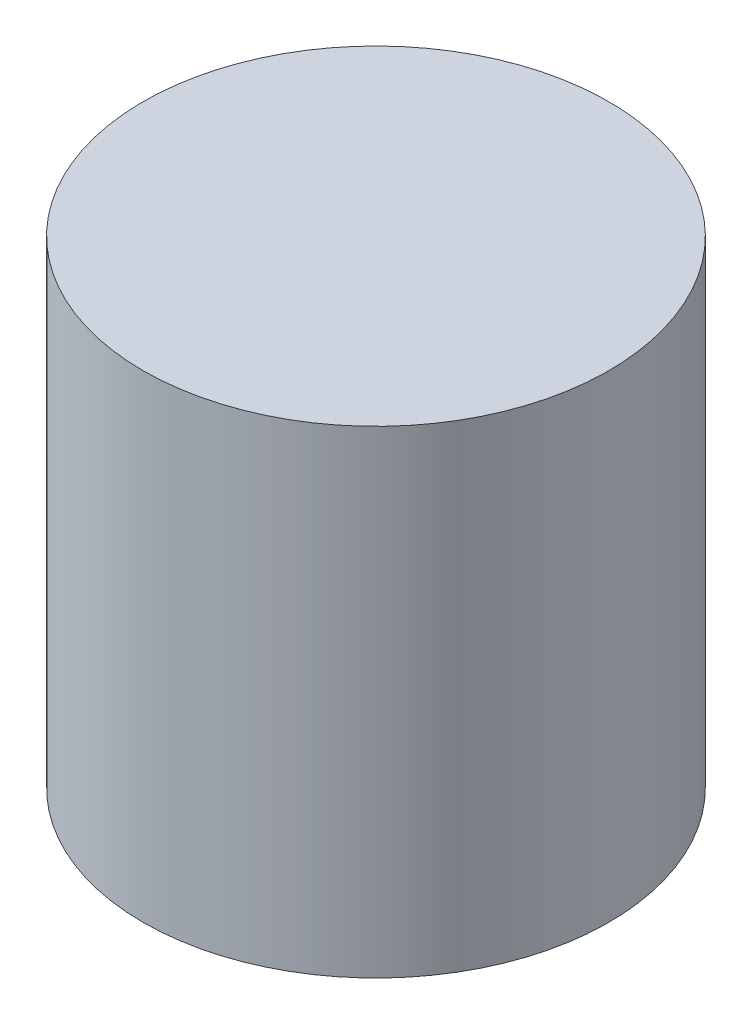
ISO-10303-21;
HEADER;
FILE_DESCRIPTION(('STEP AP214'),'2;1');
FILE_NAME('part.step','',(''),(''),'','','');
FILE_SCHEMA(('AUTOMOTIVE_DESIGN { 1 0 10303 214 1 1 1 1 }'));
ENDSEC;
DATA;
#1=APPLICATION_CONTEXT('core data for automotive mechanical design processes');
#2=APPLICATION_PROTOCOL_DEFINITION('international standard','automotive_design',2000,#1);
#3=PRODUCT_CONTEXT('',#1,'mechanical');
#4=PRODUCT('Part','Part','',(#3));
#5=PRODUCT_RELATED_PRODUCT_CATEGORY('part','',(#4));
#6=PRODUCT_DEFINITION_FORMATION('','',#4);
#7=PRODUCT_DEFINITION_CONTEXT('part definition',#1,'design');
#8=PRODUCT_DEFINITION('design','',#6,#7);
#9=PRODUCT_DEFINITION_SHAPE('','',#8);
#10=(LENGTH_UNIT() NAMED_UNIT(*) SI_UNIT(.MILLI.,.METRE.));
#11=(NAMED_UNIT(*) PLANE_ANGLE_UNIT() SI_UNIT($,.RADIAN.));
#12=(NAMED_UNIT(*) SI_UNIT($,.STERADIAN.) SOLID_ANGLE_UNIT());
#13=UNCERTAINTY_MEASURE_WITH_UNIT(LENGTH_MEASURE(1.E-05),#10,'distance_accuracy_value','');
#14=(GEOMETRIC_REPRESENTATION_CONTEXT(3) GLOBAL_UNCERTAINTY_ASSIGNED_CONTEXT((#13)) GLOBAL_UNIT_ASSIGNED_CONTEXT((#10,
#11,#12)) REPRESENTATION_CONTEXT('',''));
#15=CARTESIAN_POINT('',(0.,0.,0.));
#16=DIRECTION('',(0.,0.,1.));
#17=DIRECTION('',(1.,0.,0.));
#18=AXIS2_PLACEMENT_3D('',#15,#16,#17);
#19=CARTESIAN_POINT('',(0.,101.6,0.));
#20=DIRECTION('',(0.,-1.,0.));
#21=DIRECTION('',(0.,0.,-1.));
#22=AXIS2_PLACEMENT_3D('',#19,#20,#21);
#23=CYLINDRICAL_SURFACE('',#22,49.53);
#24=CARTESIAN_POINT('',(0.,101.6,0.));
#25=DIRECTION('',(0.,1.,0.));
#26=DIRECTION('',(0.,0.,1.));
#27=AXIS2_PLACEMENT_3D('',#24,#25,#26);
#28=CIRCLE('',#27,49.53);
#29=CARTESIAN_POINT('',(0.,101.6,49.53));
#30=VERTEX_POINT('',#29);
#31=EDGE_CURVE('E10',#30,#30,#28,.T.);
#32=ORIENTED_EDGE('',*,*,#31,.F.);
#33=EDGE_LOOP('',(#32));
#34=FACE_BOUND('',#33,.T.);
#35=CARTESIAN_POINT('',(0.,0.,0.));
#36=DIRECTION('',(0.,1.,0.));
#37=DIRECTION('',(0.,0.,1.));
#38=AXIS2_PLACEMENT_3D('',#35,#36,#37);
#39=CIRCLE('',#38,49.53);
#40=CARTESIAN_POINT('',(0.,0.,49.53));
#41=VERTEX_POINT('',#40);
#42=EDGE_CURVE('E35',#41,#41,#39,.T.);
#43=ORIENTED_EDGE('',*,*,#42,.T.);
#44=EDGE_LOOP('',(#43));
#45=FACE_BOUND('',#44,.T.);
#46=ADVANCED_FACE('F32',(#34,#45),#23,.T.);
#47=CARTESIAN_POINT('',(0.,101.6,0.));
#48=DIRECTION('',(0.,1.,0.));
#49=DIRECTION('',(0.,0.,1.));
#50=AXIS2_PLACEMENT_3D('',#47,#48,#49);
#51=PLANE('',#50);
#52=ORIENTED_EDGE('',*,*,#31,.T.);
#53=EDGE_LOOP('',(#52));
#54=FACE_BOUND('',#53,.T.);
#55=ADVANCED_FACE('F47',(#54),#51,.T.);
#56=CARTESIAN_POINT('',(0.,0.,0.));
#57=DIRECTION('',(0.,1.,0.));
#58=DIRECTION('',(0.,0.,1.));
#59=AXIS2_PLACEMENT_3D('',#56,#57,#58);
#60=PLANE('',#59);
#61=ORIENTED_EDGE('',*,*,#42,.F.);
#62=EDGE_LOOP('',(#61));
#63=FACE_BOUND('',#62,.T.);
#64=ADVANCED_FACE('F45',(#63),#60,.F.);
#65=CLOSED_SHELL('',(#46,#55,#64));
#66=MANIFOLD_SOLID_BREP('B2',#65);
#67=ADVANCED_BREP_SHAPE_REPRESENTATION('',(#18,#66),#14);
#68=SHAPE_DEFINITION_REPRESENTATION(#9,#67);
ENDSEC;
END-ISO-10303-21;
